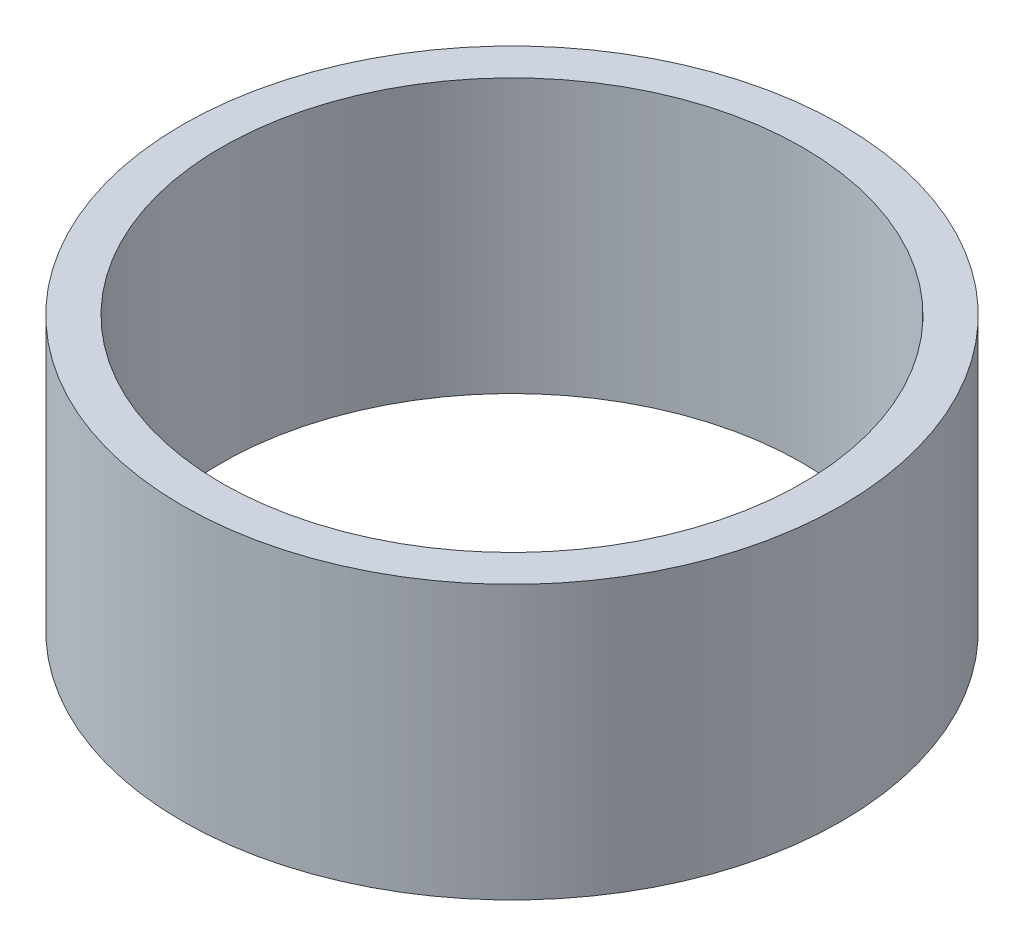
ISO-10303-21;
HEADER;
FILE_DESCRIPTION(('STEP AP214'),'2;1');
FILE_NAME('part.step','',(''),(''),'','','');
FILE_SCHEMA(('AUTOMOTIVE_DESIGN { 1 0 10303 214 1 1 1 1 }'));
ENDSEC;
DATA;
#1=APPLICATION_CONTEXT('core data for automotive mechanical design processes');
#2=APPLICATION_PROTOCOL_DEFINITION('international standard','automotive_design',2000,#1);
#3=PRODUCT_CONTEXT('',#1,'mechanical');
#4=PRODUCT('Part','Part','',(#3));
#5=PRODUCT_RELATED_PRODUCT_CATEGORY('part','',(#4));
#6=PRODUCT_DEFINITION_FORMATION('','',#4);
#7=PRODUCT_DEFINITION_CONTEXT('part definition',#1,'design');
#8=PRODUCT_DEFINITION('design','',#6,#7);
#9=PRODUCT_DEFINITION_SHAPE('','',#8);
#10=(LENGTH_UNIT() NAMED_UNIT(*) SI_UNIT(.MILLI.,.METRE.));
#11=(NAMED_UNIT(*) PLANE_ANGLE_UNIT() SI_UNIT($,.RADIAN.));
#12=(NAMED_UNIT(*) SI_UNIT($,.STERADIAN.) SOLID_ANGLE_UNIT());
#13=UNCERTAINTY_MEASURE_WITH_UNIT(LENGTH_MEASURE(1.E-05),#10,'distance_accuracy_value','');
#14=(GEOMETRIC_REPRESENTATION_CONTEXT(3) GLOBAL_UNCERTAINTY_ASSIGNED_CONTEXT((#13)) GLOBAL_UNIT_ASSIGNED_CONTEXT((#10,
#11,#12)) REPRESENTATION_CONTEXT('',''));
#15=CARTESIAN_POINT('',(0.,0.,0.));
#16=DIRECTION('',(0.,0.,1.));
#17=DIRECTION('',(1.,0.,0.));
#18=AXIS2_PLACEMENT_3D('',#15,#16,#17);
#19=CARTESIAN_POINT('',(0.,35.,0.));
#20=DIRECTION('',(0.,1.,0.));
#21=DIRECTION('',(0.,0.,1.));
#22=AXIS2_PLACEMENT_3D('',#19,#20,#21);
#23=PLANE('',#22);
#24=CARTESIAN_POINT('',(0.,35.,0.));
#25=DIRECTION('',(0.,1.,0.));
#26=DIRECTION('',(0.,0.,1.));
#27=AXIS2_PLACEMENT_3D('',#24,#25,#26);
#28=CIRCLE('',#27,42.2136598602757);
#29=CARTESIAN_POINT('',(0.,35.,42.2136598602757));
#30=VERTEX_POINT('',#29);
#31=EDGE_CURVE('E11',#30,#30,#28,.T.);
#32=ORIENTED_EDGE('',*,*,#31,.T.);
#33=EDGE_LOOP('',(#32));
#34=FACE_BOUND('',#33,.T.);
#35=CARTESIAN_POINT('',(0.,35.,0.));
#36=DIRECTION('',(0.,1.,0.));
#37=DIRECTION('',(0.,0.,1.));
#38=AXIS2_PLACEMENT_3D('',#35,#36,#37);
#39=CIRCLE('',#38,37.2136598602757);
#40=CARTESIAN_POINT('',(0.,35.,37.2136598602757));
#41=VERTEX_POINT('',#40);
#42=EDGE_CURVE('E56',#41,#41,#39,.T.);
#43=ORIENTED_EDGE('',*,*,#42,.F.);
#44=EDGE_LOOP('',(#43));
#45=FACE_BOUND('',#44,.T.);
#46=ADVANCED_FACE('F43',(#34,#45),#23,.T.);
#47=CARTESIAN_POINT('',(0.,0.,0.));
#48=DIRECTION('',(0.,1.,0.));
#49=DIRECTION('',(0.,0.,1.));
#50=AXIS2_PLACEMENT_3D('',#47,#48,#49);
#51=PLANE('',#50);
#52=CARTESIAN_POINT('',(0.,0.,0.));
#53=DIRECTION('',(0.,1.,0.));
#54=DIRECTION('',(0.,0.,1.));
#55=AXIS2_PLACEMENT_3D('',#52,#53,#54);
#56=CIRCLE('',#55,42.2136598602757);
#57=CARTESIAN_POINT('',(0.,0.,42.2136598602757));
#58=VERTEX_POINT('',#57);
#59=EDGE_CURVE('E47',#58,#58,#56,.T.);
#60=ORIENTED_EDGE('',*,*,#59,.F.);
#61=EDGE_LOOP('',(#60));
#62=FACE_BOUND('',#61,.T.);
#63=CARTESIAN_POINT('',(0.,0.,0.));
#64=DIRECTION('',(0.,1.,0.));
#65=DIRECTION('',(0.,0.,1.));
#66=AXIS2_PLACEMENT_3D('',#63,#64,#65);
#67=CIRCLE('',#66,37.2136598602757);
#68=CARTESIAN_POINT('',(0.,0.,37.2136598602757));
#69=VERTEX_POINT('',#68);
#70=EDGE_CURVE('E58',#69,#69,#67,.T.);
#71=ORIENTED_EDGE('',*,*,#70,.T.);
#72=EDGE_LOOP('',(#71));
#73=FACE_BOUND('',#72,.T.);
#74=ADVANCED_FACE('F70',(#62,#73),#51,.F.);
#75=CARTESIAN_POINT('',(0.,35.,0.));
#76=DIRECTION('',(0.,-1.,0.));
#77=DIRECTION('',(0.,0.,-1.));
#78=AXIS2_PLACEMENT_3D('',#75,#76,#77);
#79=CYLINDRICAL_SURFACE('',#78,42.2136598602757);
#80=ORIENTED_EDGE('',*,*,#31,.F.);
#81=EDGE_LOOP('',(#80));
#82=FACE_BOUND('',#81,.T.);
#83=ORIENTED_EDGE('',*,*,#59,.T.);
#84=EDGE_LOOP('',(#83));
#85=FACE_BOUND('',#84,.T.);
#86=ADVANCED_FACE('F45',(#82,#85),#79,.T.);
#87=CARTESIAN_POINT('',(0.,35.,0.));
#88=DIRECTION('',(0.,-1.,0.));
#89=DIRECTION('',(0.,0.,-1.));
#90=AXIS2_PLACEMENT_3D('',#87,#88,#89);
#91=CYLINDRICAL_SURFACE('',#90,37.2136598602757);
#92=ORIENTED_EDGE('',*,*,#42,.T.);
#93=EDGE_LOOP('',(#92));
#94=FACE_BOUND('',#93,.T.);
#95=ORIENTED_EDGE('',*,*,#70,.F.);
#96=EDGE_LOOP('',(#95));
#97=FACE_BOUND('',#96,.T.);
#98=ADVANCED_FACE('F66',(#94,#97),#91,.F.);
#99=CLOSED_SHELL('',(#46,#74,#86,#98));
#100=MANIFOLD_SOLID_BREP('B2',#99);
#101=ADVANCED_BREP_SHAPE_REPRESENTATION('',(#18,#100),#14);
#102=SHAPE_DEFINITION_REPRESENTATION(#9,#101);
ENDSEC;
END-ISO-10303-21;
